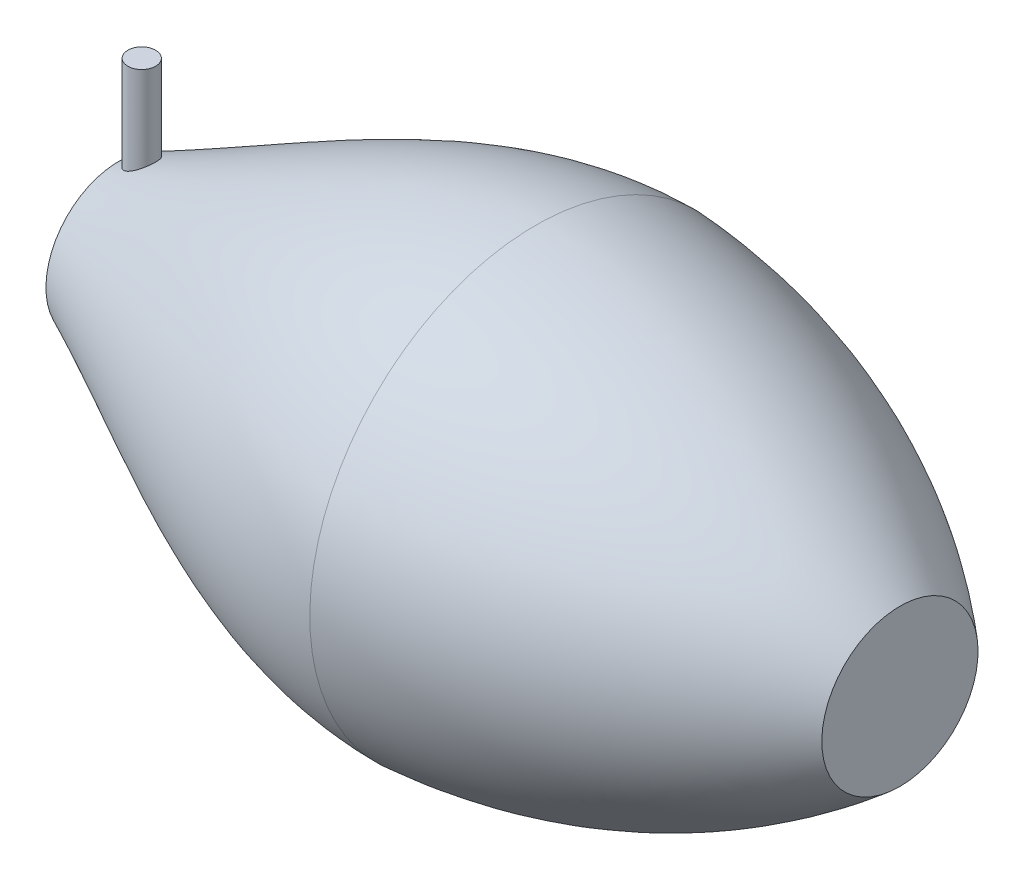
ISO-10303-21;
HEADER;
FILE_DESCRIPTION(('STEP AP214'),'2;1');
FILE_NAME('part.step','',(''),(''),'','','');
FILE_SCHEMA(('AUTOMOTIVE_DESIGN { 1 0 10303 214 1 1 1 1 }'));
ENDSEC;
DATA;
#1=APPLICATION_CONTEXT('core data for automotive mechanical design processes');
#2=APPLICATION_PROTOCOL_DEFINITION('international standard','automotive_design',2000,#1);
#3=PRODUCT_CONTEXT('',#1,'mechanical');
#4=PRODUCT('Part','Part','',(#3));
#5=PRODUCT_RELATED_PRODUCT_CATEGORY('part','',(#4));
#6=PRODUCT_DEFINITION_FORMATION('','',#4);
#7=PRODUCT_DEFINITION_CONTEXT('part definition',#1,'design');
#8=PRODUCT_DEFINITION('design','',#6,#7);
#9=PRODUCT_DEFINITION_SHAPE('','',#8);
#10=(LENGTH_UNIT() NAMED_UNIT(*) SI_UNIT(.MILLI.,.METRE.));
#11=(NAMED_UNIT(*) PLANE_ANGLE_UNIT() SI_UNIT($,.RADIAN.));
#12=(NAMED_UNIT(*) SI_UNIT($,.STERADIAN.) SOLID_ANGLE_UNIT());
#13=UNCERTAINTY_MEASURE_WITH_UNIT(LENGTH_MEASURE(1.E-05),#10,'distance_accuracy_value','');
#14=(GEOMETRIC_REPRESENTATION_CONTEXT(3) GLOBAL_UNCERTAINTY_ASSIGNED_CONTEXT((#13)) GLOBAL_UNIT_ASSIGNED_CONTEXT((#10,
#11,#12)) REPRESENTATION_CONTEXT('',''));
#15=CARTESIAN_POINT('',(0.,0.,0.));
#16=DIRECTION('',(0.,0.,1.));
#17=DIRECTION('',(1.,0.,0.));
#18=AXIS2_PLACEMENT_3D('',#15,#16,#17);
#19=CARTESIAN_POINT('',(0.,65.,0.));
#20=CARTESIAN_POINT('',(-44.636693971642,64.5751624176577,0.));
#21=CARTESIAN_POINT('',(-81.3166352439901,38.8634808286826,0.));
#22=CARTESIAN_POINT('',(-120.,21.,0.));
#23=B_SPLINE_CURVE_WITH_KNOTS('',3,(#19,#20,#21,#22),.UNSPECIFIED.,.F.,.F.,(4,4),(0.,1.),.UNSPECIFIED.);
#24=CARTESIAN_POINT('',(-120.,0.,0.));
#25=DIRECTION('',(-1.,0.,0.));
#26=AXIS1_PLACEMENT('',#24,#25);
#27=SURFACE_OF_REVOLUTION('',#23,#26);
#28=CARTESIAN_POINT('',(-120.,0.,0.));
#29=DIRECTION('',(-1.,0.,0.));
#30=DIRECTION('',(0.,-1.,0.));
#31=AXIS2_PLACEMENT_3D('',#28,#29,#30);
#32=CIRCLE('',#31,21.);
#33=CARTESIAN_POINT('',(-120.,-21.,0.));
#34=VERTEX_POINT('',#33);
#35=EDGE_CURVE('E50',#34,#34,#32,.T.);
#36=ORIENTED_EDGE('',*,*,#35,.F.);
#37=EDGE_LOOP('',(#36));
#38=FACE_BOUND('',#37,.T.);
#39=CARTESIAN_POINT('',(0.,0.,0.));
#40=DIRECTION('',(-1.,0.,0.));
#41=DIRECTION('',(0.,-1.,0.));
#42=AXIS2_PLACEMENT_3D('',#39,#40,#41);
#43=CIRCLE('',#42,65.);
#44=CARTESIAN_POINT('',(0.,-65.,0.));
#45=VERTEX_POINT('',#44);
#46=EDGE_CURVE('E42',#45,#45,#43,.T.);
#47=ORIENTED_EDGE('',*,*,#46,.T.);
#48=EDGE_LOOP('',(#47));
#49=FACE_BOUND('',#48,.T.);
#50=CARTESIAN_POINT('',(-109.41069221047,26.0819082158401,0.));
#51=CARTESIAN_POINT('',(-109.410688466032,26.0819110575932,-0.09995167058474));
#52=CARTESIAN_POINT('',(-109.414440914609,26.0794755771668,-0.19987042263448));
#53=CARTESIAN_POINT('',(-109.429380106592,26.0697890378281,-0.398863426234961));
#54=CARTESIAN_POINT('',(-109.440561878993,26.0625411988961,-0.497938197633839));
#55=CARTESIAN_POINT('',(-109.47020663631,26.0433539337966,-0.69460362796072));
#56=CARTESIAN_POINT('',(-109.488675316883,26.0314108377083,-0.792193063788739));
#57=CARTESIAN_POINT('',(-109.532640932199,26.0030375911661,-0.985146666415974));
#58=CARTESIAN_POINT('',(-109.558140696999,25.9866056339413,-1.08050992036228));
#59=CARTESIAN_POINT('',(-109.615680838571,25.949623102953,-1.26784742230977));
#60=CARTESIAN_POINT('',(-109.647685823426,25.9290948259762,-1.35983695691443));
#61=CARTESIAN_POINT('',(-109.717936752685,25.8841757242034,-1.54044153368792));
#62=CARTESIAN_POINT('',(-109.756185071644,25.8597834298928,-1.62905527604829));
#63=CARTESIAN_POINT('',(-109.879808415801,25.7812310174598,-1.88937521070752));
#64=CARTESIAN_POINT('',(-109.974008259388,25.7217300539718,-2.0553885267618));
#65=CARTESIAN_POINT('',(-110.189407177091,25.5870041929333,-2.37988147456035));
#66=CARTESIAN_POINT('',(-110.312001535433,25.5109879358145,-2.53709191195907));
#67=CARTESIAN_POINT('',(-110.575906226814,25.3494201192907,-2.82889865356131));
#68=CARTESIAN_POINT('',(-110.71720192249,25.2638760254508,-2.96351245892581));
#69=CARTESIAN_POINT('',(-111.038361852216,25.0723123556447,-3.22828537664687));
#70=CARTESIAN_POINT('',(-111.220808003757,24.9651760908291,-3.35450609763275));
#71=CARTESIAN_POINT('',(-111.601721410103,24.7459773962685,-3.57435807197772));
#72=CARTESIAN_POINT('',(-111.80019880874,24.6339118682612,-3.66796848886656));
#73=CARTESIAN_POINT('',(-112.234102265099,24.3945540654745,-3.83089025406766));
#74=CARTESIAN_POINT('',(-112.471077277278,24.2670769974063,-3.89582486376618));
#75=CARTESIAN_POINT('',(-112.954525333933,24.0147418575291,-3.98147118821175));
#76=CARTESIAN_POINT('',(-113.201001532279,23.8898846769915,-4.00216808752219));
#77=CARTESIAN_POINT('',(-113.575986793857,23.7062598497999,-3.99861249299901));
#78=CARTESIAN_POINT('',(-113.703570111182,23.6448821295787,-3.99132526003826));
#79=CARTESIAN_POINT('',(-113.958520486241,23.5244725949306,-3.96437792331544));
#80=CARTESIAN_POINT('',(-114.085887612093,23.4654398103716,-3.94472299413012));
#81=CARTESIAN_POINT('',(-114.339332840907,23.3502314387473,-3.89286017807939));
#82=CARTESIAN_POINT('',(-114.465411105689,23.2940554893883,-3.86065388744373));
#83=CARTESIAN_POINT('',(-114.715117890142,23.1850250889044,-3.78358818591772));
#84=CARTESIAN_POINT('',(-114.838746649729,23.1321703113763,-3.73873002083382));
#85=CARTESIAN_POINT('',(-115.073384584335,23.0339295956058,-3.64011654159893));
#86=CARTESIAN_POINT('',(-115.184656584785,22.9882800766017,-3.58724859072412));
#87=CARTESIAN_POINT('',(-115.402894145912,22.9004988403674,-3.47079585008269));
#88=CARTESIAN_POINT('',(-115.509860195007,22.8583667235774,-3.40721228004183));
#89=CARTESIAN_POINT('',(-115.718304066094,22.777878108173,-3.2696351380226));
#90=CARTESIAN_POINT('',(-115.819784633334,22.7395197129411,-3.19564684120443));
#91=CARTESIAN_POINT('',(-116.016157210195,22.6667360930652,-3.03766799573943));
#92=CARTESIAN_POINT('',(-116.111049851619,22.6323104910481,-2.95367840835358));
#93=CARTESIAN_POINT('',(-116.284125962667,22.5707046100907,-2.78505018351288));
#94=CARTESIAN_POINT('',(-116.363034346953,22.5431446113675,-2.70129266234729));
#95=CARTESIAN_POINT('',(-116.513778530673,22.4913529606077,-2.52668842087331));
#96=CARTESIAN_POINT('',(-116.585614962295,22.4671210109881,-2.43584233554138));
#97=CARTESIAN_POINT('',(-116.721456353175,22.4219946739543,-2.24773167440297));
#98=CARTESIAN_POINT('',(-116.785463373914,22.4010994075482,-2.15046879856215));
#99=CARTESIAN_POINT('',(-116.9049942304,22.3626135412334,-1.95024255455177));
#100=CARTESIAN_POINT('',(-116.960518351883,22.3450228300103,-1.84727937854865));
#101=CARTESIAN_POINT('',(-117.059372363793,22.3140777317624,-1.64292952732168));
#102=CARTESIAN_POINT('',(-117.103240615367,22.3005299525748,-1.54183208715491));
#103=CARTESIAN_POINT('',(-117.182587972593,22.2762548542612,-1.33602706125758));
#104=CARTESIAN_POINT('',(-117.218064284415,22.2655284742975,-1.23131828650401));
#105=CARTESIAN_POINT('',(-117.280260217681,22.2468595961611,-1.01914633059183));
#106=CARTESIAN_POINT('',(-117.306984154089,22.2389157260627,-0.911684534947228));
#107=CARTESIAN_POINT('',(-117.351458812011,22.2257601769271,-0.694713099841716));
#108=CARTESIAN_POINT('',(-117.369206247245,22.2205494984801,-0.585202725592941));
#109=CARTESIAN_POINT('',(-117.395249362118,22.2129216967789,-0.367491551074184));
#110=CARTESIAN_POINT('',(-117.403750242609,22.2104439066196,-0.259317364650176));
#111=CARTESIAN_POINT('',(-117.411936242563,22.2080576845509,-0.0425675589554592));
#112=CARTESIAN_POINT('',(-117.411618162665,22.208150185097,0.0660081917125457));
#113=CARTESIAN_POINT('',(-117.402162975774,22.2109068599926,0.282696141580985));
#114=CARTESIAN_POINT('',(-117.393029576553,22.2135699531367,0.390808516477496));
#115=CARTESIAN_POINT('',(-117.366025119657,22.2214835691148,0.605881306177687));
#116=CARTESIAN_POINT('',(-117.34815084231,22.2267350453764,0.712841281650153));
#117=CARTESIAN_POINT('',(-117.30392382075,22.2398251358326,0.924318019463256));
#118=CARTESIAN_POINT('',(-117.277610321681,22.2476517789388,1.02884373465766));
#119=CARTESIAN_POINT('',(-117.216702997566,22.2659405135218,1.23525920536472));
#120=CARTESIAN_POINT('',(-117.182106152895,22.2764035661526,1.33714798456049));
#121=CARTESIAN_POINT('',(-117.104959633333,22.3000027616751,1.53750012501838));
#122=CARTESIAN_POINT('',(-117.062413198264,22.3131378157967,1.63596486241263));
#123=CARTESIAN_POINT('',(-116.969718784378,22.3421318889737,1.82887562499311));
#124=CARTESIAN_POINT('',(-116.919567995492,22.3579919152899,1.92332014797921));
#125=CARTESIAN_POINT('',(-116.81180622389,22.3925694058228,2.10806191848758));
#126=CARTESIAN_POINT('',(-116.754153384897,22.411303016238,2.19833172546903));
#127=CARTESIAN_POINT('',(-116.632111402336,22.4515881021358,2.37357660468209));
#128=CARTESIAN_POINT('',(-116.567719814979,22.4731406005932,2.45854973814007));
#129=CARTESIAN_POINT('',(-116.432800587865,22.5190559356283,2.6226192732641));
#130=CARTESIAN_POINT('',(-116.362275090818,22.5434177917964,2.70171770933412));
#131=CARTESIAN_POINT('',(-116.215677756831,22.5949325221181,2.85363286139316));
#132=CARTESIAN_POINT('',(-116.139603851275,22.6220864387998,2.92644721216381));
#133=CARTESIAN_POINT('',(-115.900130547531,22.7090842840499,3.13827073899938));
#134=CARTESIAN_POINT('',(-115.72876111055,22.7733658353595,3.26668602698741));
#135=CARTESIAN_POINT('',(-115.371114229139,22.9126247193515,3.49308582617616));
#136=CARTESIAN_POINT('',(-115.184833369363,22.9876045054762,3.59106334061494));
#137=CARTESIAN_POINT('',(-114.791507368647,23.1516476061869,3.76056206007022));
#138=CARTESIAN_POINT('',(-114.583885206993,23.2412791540338,3.83019348980951));
#139=CARTESIAN_POINT('',(-114.163790152086,23.4290394551305,3.93443163125098));
#140=CARTESIAN_POINT('',(-113.951315414904,23.5271714794063,3.96902479447664));
#141=CARTESIAN_POINT('',(-113.507168180686,23.7388169628957,4.00558988943537));
#142=CARTESIAN_POINT('',(-113.275507817907,23.8529175488339,4.00430756851278));
#143=CARTESIAN_POINT('',(-112.817814659772,24.0851890659296,3.96249391289463));
#144=CARTESIAN_POINT('',(-112.591784399165,24.203361775322,3.92194521621084));
#145=CARTESIAN_POINT('',(-112.131541911946,24.4502643483423,3.79806309670546));
#146=CARTESIAN_POINT('',(-111.898246799881,24.5790442076924,3.71141039280744));
#147=CARTESIAN_POINT('',(-111.449570763537,24.8325598321968,3.49513754729064));
#148=CARTESIAN_POINT('',(-111.234201446605,24.9572929455876,3.36548983209563));
#149=CARTESIAN_POINT('',(-110.929063846613,25.1373792507031,3.139702892676));
#150=CARTESIAN_POINT('',(-110.829963930413,25.1964695424721,3.05881961868931));
#151=CARTESIAN_POINT('',(-110.638899664675,25.3113846777471,2.88681077705763));
#152=CARTESIAN_POINT('',(-110.546936806329,25.3672088382429,2.79568307866574));
#153=CARTESIAN_POINT('',(-110.371331173485,25.4746204942709,2.60368876367451));
#154=CARTESIAN_POINT('',(-110.287678469639,25.5262130327584,2.5028340605135));
#155=CARTESIAN_POINT('',(-110.129717013335,25.6242736950886,2.29184274957862));
#156=CARTESIAN_POINT('',(-110.055400681427,25.6707459718411,2.1817137937531));
#157=CARTESIAN_POINT('',(-109.935547713158,25.7461034419685,1.98318640100668));
#158=CARTESIAN_POINT('',(-109.887602803676,25.7763860408786,1.89676139235615));
#159=CARTESIAN_POINT('',(-109.797845148358,25.8332765616206,1.71964714580853));
#160=CARTESIAN_POINT('',(-109.756030319842,25.8598857313105,1.62895937006895));
#161=CARTESIAN_POINT('',(-109.679049127165,25.9090153136532,1.44390555837685));
#162=CARTESIAN_POINT('',(-109.643872197734,25.9315422215678,1.34954566098713));
#163=CARTESIAN_POINT('',(-109.580500663489,25.9722177580587,1.15752740891027));
#164=CARTESIAN_POINT('',(-109.552310895406,25.9903633535303,1.0598668222301));
#165=CARTESIAN_POINT('',(-109.489284606453,26.0309994873045,0.805145841857522));
#166=CARTESIAN_POINT('',(-109.45990080155,26.0500182425941,0.646126008484584));
#167=CARTESIAN_POINT('',(-109.420609536897,26.0754690761153,0.324708072484678));
#168=CARTESIAN_POINT('',(-109.410698291029,26.0819036011423,0.162310632784421));
#169=CARTESIAN_POINT('',(-109.41069221047,26.0819082158401,0.));
#170=B_SPLINE_CURVE_WITH_KNOTS('',3,(#50,#51,#52,#53,#54,#55,#56,#57,#58,#59,#60,#61,#62,#63,
#64,#65,#66,#67,#68,#69,#70,#71,#72,#73,#74,#75,#76,#77,#78,#79,#80,#81,#82,#83,#84,#85,#86,#87,
#88,#89,#90,#91,#92,#93,#94,#95,#96,#97,#98,#99,#100,#101,#102,#103,#104,#105,#106,#107,#108,
#109,#110,#111,#112,#113,#114,#115,#116,#117,#118,#119,#120,#121,#122,#123,#124,#125,#126,#127,
#128,#129,#130,#131,#132,#133,#134,#135,#136,#137,#138,#139,#140,#141,#142,#143,#144,#145,#146,
#147,#148,#149,#150,#151,#152,#153,#154,#155,#156,#157,#158,#159,#160,#161,#162,#163,#164,#165,
#166,#167,#168,#169),.UNSPECIFIED.,.T.,.F.,(4,2,2,2,2,2,2,2,2,2,2,2,2,2,2,2,2,2,2,2,2,2,2,2,2,2,
2,2,2,2,2,2,2,2,2,2,2,2,2,2,2,2,2,2,2,2,2,2,2,2,2,2,2,2,2,2,2,2,2,4),(0.,0.299698751807752,
0.599197175037415,0.898930160025931,1.19878396604055,1.4970480896942,1.79542591895896,
2.39272451310957,3.03042591487586,3.66763111304683,4.40379358535907,5.14042557226455,
5.96722262210592,6.79429652717087,7.21913330396425,7.6437924494449,8.06839760616226,
8.49296096739086,8.88656358272643,9.2801214257176,9.67348045084014,10.0668016992438,
10.4213282996277,10.7758231787521,11.1302245176853,11.4846139164362,11.8173122894336,
12.1501212683537,12.4827659229572,12.8155322701279,13.1407528618259,13.4660914392851,
13.7912932371515,14.116614912304,14.4404451525829,14.7643936226767,15.088210355763,
15.4121470432421,15.7379754817981,16.0639224933252,16.3897560981581,16.7157118109528,
17.3832456209379,18.0509327642506,18.7577988903869,19.464938240861,20.2364137279041,
21.0082304857368,21.8451261588759,22.682559591544,23.1047956015702,23.5271195958908,
23.9489327508822,24.3704012259039,24.6802011512326,24.9898955776968,25.2990928399668,
25.6085035442071,26.0952763477452,26.5819544969551),.UNSPECIFIED.);
#171=CARTESIAN_POINT('',(-109.41069221047,26.0819082158401,0.));
#172=VERTEX_POINT('',#171);
#173=EDGE_CURVE('E10',#172,#172,#170,.T.);
#174=ORIENTED_EDGE('',*,*,#173,.F.);
#175=EDGE_LOOP('',(#174));
#176=FACE_BOUND('',#175,.T.);
#177=ADVANCED_FACE('F31',(#38,#49,#176),#27,.T.);
#178=CARTESIAN_POINT('',(105.,22.5,0.));
#179=CARTESIAN_POINT('',(59.0932226624193,61.0777756035268,0.));
#180=CARTESIAN_POINT('',(0.,65.,0.));
#181=B_SPLINE_CURVE_WITH_KNOTS('',2,(#178,#179,#180),.UNSPECIFIED.,.F.,.F.,(3,3),(0.,1.),.UNSPECIFIED.);
#182=CARTESIAN_POINT('',(-120.,0.,0.));
#183=DIRECTION('',(-1.,0.,0.));
#184=AXIS1_PLACEMENT('',#182,#183);
#185=SURFACE_OF_REVOLUTION('',#181,#184);
#186=ORIENTED_EDGE('',*,*,#46,.F.);
#187=EDGE_LOOP('',(#186));
#188=FACE_BOUND('',#187,.T.);
#189=CARTESIAN_POINT('',(105.,0.,0.));
#190=DIRECTION('',(-1.,0.,0.));
#191=DIRECTION('',(0.,-1.,0.));
#192=AXIS2_PLACEMENT_3D('',#189,#190,#191);
#193=CIRCLE('',#192,22.5);
#194=CARTESIAN_POINT('',(105.,-22.5,0.));
#195=VERTEX_POINT('',#194);
#196=EDGE_CURVE('E46',#195,#195,#193,.T.);
#197=ORIENTED_EDGE('',*,*,#196,.T.);
#198=EDGE_LOOP('',(#197));
#199=FACE_BOUND('',#198,.T.);
#200=ADVANCED_FACE('F66',(#188,#199),#185,.T.);
#201=CARTESIAN_POINT('',(105.,22.5,0.));
#202=DIRECTION('',(-1.,0.,0.));
#203=DIRECTION('',(0.,-1.,0.));
#204=AXIS2_PLACEMENT_3D('',#201,#202,#203);
#205=PLANE('',#204);
#206=ORIENTED_EDGE('',*,*,#196,.F.);
#207=EDGE_LOOP('',(#206));
#208=FACE_BOUND('',#207,.T.);
#209=ADVANCED_FACE('F69',(#208),#205,.F.);
#210=CARTESIAN_POINT('',(-120.,21.,0.));
#211=DIRECTION('',(1.,0.,0.));
#212=DIRECTION('',(0.,1.,0.));
#213=AXIS2_PLACEMENT_3D('',#210,#211,#212);
#214=PLANE('',#213);
#215=ORIENTED_EDGE('',*,*,#35,.T.);
#216=EDGE_LOOP('',(#215));
#217=FACE_BOUND('',#216,.T.);
#218=ADVANCED_FACE('F73',(#217),#214,.F.);
#219=CARTESIAN_POINT('',(-113.41069221047,50.,0.));
#220=DIRECTION('',(0.,-1.,0.));
#221=DIRECTION('',(0.,0.,-1.));
#222=AXIS2_PLACEMENT_3D('',#219,#220,#221);
#223=CYLINDRICAL_SURFACE('',#222,4.00000000000001);
#224=CARTESIAN_POINT('',(-113.41069221047,50.,0.));
#225=DIRECTION('',(0.,1.,0.));
#226=DIRECTION('',(0.,0.,1.));
#227=AXIS2_PLACEMENT_3D('',#224,#225,#226);
#228=CIRCLE('',#227,4.00000000000001);
#229=CARTESIAN_POINT('',(-113.41069221047,50.,4.00000000000001));
#230=VERTEX_POINT('',#229);
#231=EDGE_CURVE('E55',#230,#230,#228,.T.);
#232=ORIENTED_EDGE('',*,*,#231,.F.);
#233=EDGE_LOOP('',(#232));
#234=FACE_BOUND('',#233,.T.);
#235=ORIENTED_EDGE('',*,*,#173,.T.);
#236=EDGE_LOOP('',(#235));
#237=FACE_BOUND('',#236,.T.);
#238=ADVANCED_FACE('F76',(#234,#237),#223,.T.);
#239=CARTESIAN_POINT('',(-113.41069221047,50.,0.));
#240=DIRECTION('',(0.,1.,0.));
#241=DIRECTION('',(0.,0.,1.));
#242=AXIS2_PLACEMENT_3D('',#239,#240,#241);
#243=PLANE('',#242);
#244=ORIENTED_EDGE('',*,*,#231,.T.);
#245=EDGE_LOOP('',(#244));
#246=FACE_BOUND('',#245,.T.);
#247=ADVANCED_FACE('F81',(#246),#243,.T.);
#248=CLOSED_SHELL('',(#177,#200,#209,#218,#238,#247));
#249=MANIFOLD_SOLID_BREP('B2',#248);
#250=ADVANCED_BREP_SHAPE_REPRESENTATION('',(#18,#249),#14);
#251=SHAPE_DEFINITION_REPRESENTATION(#9,#250);
ENDSEC;
END-ISO-10303-21;
